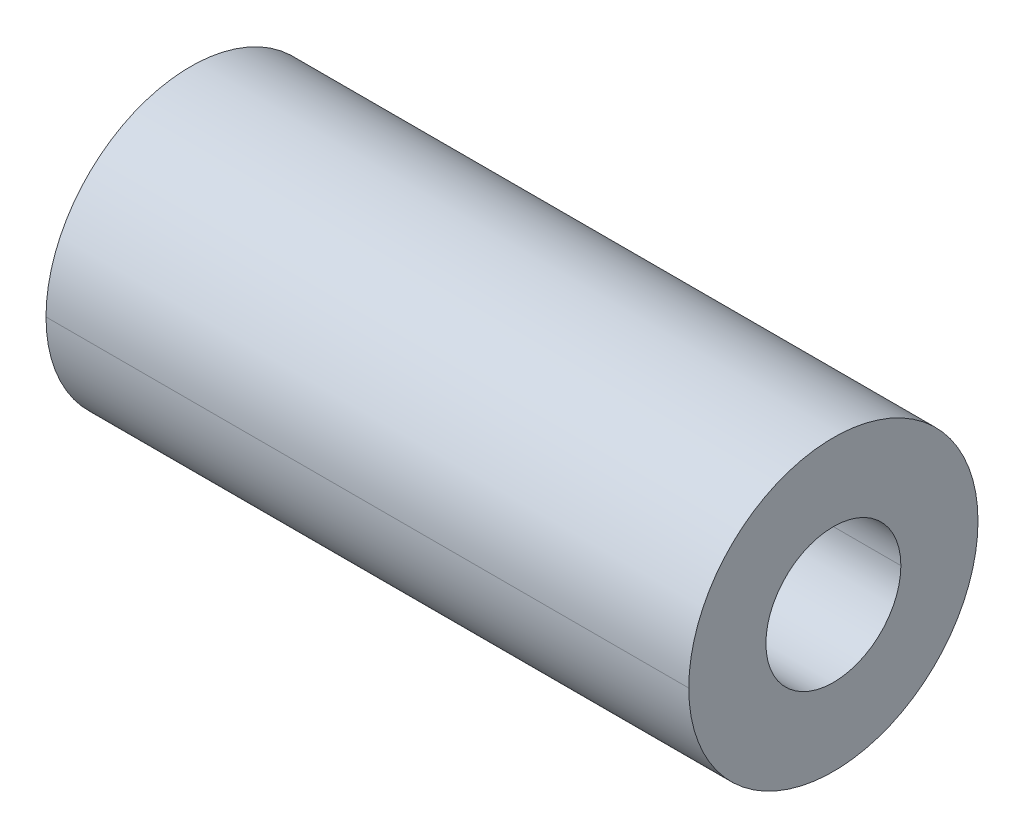
ISO-10303-21;
HEADER;
FILE_DESCRIPTION(('STEP AP214'),'2;1');
FILE_NAME('part.step','',(''),(''),'','','');
FILE_SCHEMA(('AUTOMOTIVE_DESIGN { 1 0 10303 214 1 1 1 1 }'));
ENDSEC;
DATA;
#1=APPLICATION_CONTEXT('core data for automotive mechanical design processes');
#2=APPLICATION_PROTOCOL_DEFINITION('international standard','automotive_design',2000,#1);
#3=PRODUCT_CONTEXT('',#1,'mechanical');
#4=PRODUCT('Part','Part','',(#3));
#5=PRODUCT_RELATED_PRODUCT_CATEGORY('part','',(#4));
#6=PRODUCT_DEFINITION_FORMATION('','',#4);
#7=PRODUCT_DEFINITION_CONTEXT('part definition',#1,'design');
#8=PRODUCT_DEFINITION('design','',#6,#7);
#9=PRODUCT_DEFINITION_SHAPE('','',#8);
#10=(LENGTH_UNIT() NAMED_UNIT(*) SI_UNIT(.MILLI.,.METRE.));
#11=(NAMED_UNIT(*) PLANE_ANGLE_UNIT() SI_UNIT($,.RADIAN.));
#12=(NAMED_UNIT(*) SI_UNIT($,.STERADIAN.) SOLID_ANGLE_UNIT());
#13=UNCERTAINTY_MEASURE_WITH_UNIT(LENGTH_MEASURE(1.E-05),#10,'distance_accuracy_value','');
#14=(GEOMETRIC_REPRESENTATION_CONTEXT(3) GLOBAL_UNCERTAINTY_ASSIGNED_CONTEXT((#13)) GLOBAL_UNIT_ASSIGNED_CONTEXT((#10,
#11,#12)) REPRESENTATION_CONTEXT('',''));
#15=CARTESIAN_POINT('',(0.,0.,0.));
#16=DIRECTION('',(0.,0.,1.));
#17=DIRECTION('',(1.,0.,0.));
#18=AXIS2_PLACEMENT_3D('',#15,#16,#17);
#19=CARTESIAN_POINT('',(0.,0.,0.));
#20=DIRECTION('',(1.,0.,0.));
#21=DIRECTION('',(0.,0.,-1.));
#22=AXIS2_PLACEMENT_3D('',#19,#20,#21);
#23=CYLINDRICAL_SURFACE('',#22,4.5);
#24=CARTESIAN_POINT('',(-20.,0.,0.));
#25=DIRECTION('',(1.,0.,0.));
#26=DIRECTION('',(0.,0.,-1.));
#27=AXIS2_PLACEMENT_3D('',#24,#25,#26);
#28=CIRCLE('',#27,4.5);
#29=CARTESIAN_POINT('',(-20.,0.,-4.5));
#30=VERTEX_POINT('',#29);
#31=CARTESIAN_POINT('',(-20.,0.,4.5));
#32=VERTEX_POINT('',#31);
#33=EDGE_CURVE('E11',#30,#32,#28,.T.);
#34=ORIENTED_EDGE('',*,*,#33,.T.);
#35=DIRECTION('',(1.,0.,0.));
#36=VECTOR('',#35,1.);
#37=CARTESIAN_POINT('',(0.,0.,4.5));
#38=LINE('',#37,#36);
#39=CARTESIAN_POINT('',(0.,0.,4.5));
#40=VERTEX_POINT('',#39);
#41=EDGE_CURVE('E27',#32,#40,#38,.T.);
#42=ORIENTED_EDGE('',*,*,#41,.T.);
#43=CARTESIAN_POINT('',(0.,0.,0.));
#44=DIRECTION('',(1.,0.,0.));
#45=DIRECTION('',(0.,0.,-1.));
#46=AXIS2_PLACEMENT_3D('',#43,#44,#45);
#47=CIRCLE('',#46,4.5);
#48=CARTESIAN_POINT('',(0.,0.,-4.5));
#49=VERTEX_POINT('',#48);
#50=EDGE_CURVE('E93',#49,#40,#47,.T.);
#51=ORIENTED_EDGE('',*,*,#50,.F.);
#52=DIRECTION('',(1.,0.,0.));
#53=VECTOR('',#52,1.);
#54=CARTESIAN_POINT('',(0.,0.,-4.5));
#55=LINE('',#54,#53);
#56=EDGE_CURVE('E81',#30,#49,#55,.T.);
#57=ORIENTED_EDGE('',*,*,#56,.F.);
#58=EDGE_LOOP('',(#34,#42,#51,#57));
#59=FACE_BOUND('',#58,.T.);
#60=ADVANCED_FACE('F17',(#59),#23,.T.);
#61=CARTESIAN_POINT('',(0.,0.,0.));
#62=DIRECTION('',(1.,0.,0.));
#63=DIRECTION('',(0.,0.,-1.));
#64=AXIS2_PLACEMENT_3D('',#61,#62,#63);
#65=CYLINDRICAL_SURFACE('',#64,2.1);
#66=CARTESIAN_POINT('',(-20.,0.,0.));
#67=DIRECTION('',(1.,0.,0.));
#68=DIRECTION('',(0.,0.,-1.));
#69=AXIS2_PLACEMENT_3D('',#66,#67,#68);
#70=CIRCLE('',#69,2.1);
#71=CARTESIAN_POINT('',(-20.,0.,2.1));
#72=VERTEX_POINT('',#71);
#73=CARTESIAN_POINT('',(-20.,0.,-2.1));
#74=VERTEX_POINT('',#73);
#75=EDGE_CURVE('E74',#72,#74,#70,.T.);
#76=ORIENTED_EDGE('',*,*,#75,.F.);
#77=DIRECTION('',(1.,0.,0.));
#78=VECTOR('',#77,1.);
#79=CARTESIAN_POINT('',(0.,0.,2.1));
#80=LINE('',#79,#78);
#81=CARTESIAN_POINT('',(0.,0.,2.1));
#82=VERTEX_POINT('',#81);
#83=EDGE_CURVE('E107',#72,#82,#80,.T.);
#84=ORIENTED_EDGE('',*,*,#83,.T.);
#85=CARTESIAN_POINT('',(0.,0.,0.));
#86=DIRECTION('',(1.,0.,0.));
#87=DIRECTION('',(0.,0.,-1.));
#88=AXIS2_PLACEMENT_3D('',#85,#86,#87);
#89=CIRCLE('',#88,2.1);
#90=CARTESIAN_POINT('',(0.,0.,-2.1));
#91=VERTEX_POINT('',#90);
#92=EDGE_CURVE('E111',#82,#91,#89,.T.);
#93=ORIENTED_EDGE('',*,*,#92,.T.);
#94=DIRECTION('',(1.,0.,0.));
#95=VECTOR('',#94,1.);
#96=CARTESIAN_POINT('',(0.,0.,-2.1));
#97=LINE('',#96,#95);
#98=EDGE_CURVE('E63',#74,#91,#97,.T.);
#99=ORIENTED_EDGE('',*,*,#98,.F.);
#100=EDGE_LOOP('',(#76,#84,#93,#99));
#101=FACE_BOUND('',#100,.T.);
#102=ADVANCED_FACE('F163',(#101),#65,.F.);
#103=CARTESIAN_POINT('',(0.,0.,0.));
#104=DIRECTION('',(1.,0.,0.));
#105=DIRECTION('',(0.,0.,-1.));
#106=AXIS2_PLACEMENT_3D('',#103,#104,#105);
#107=CYLINDRICAL_SURFACE('',#106,2.1);
#108=ORIENTED_EDGE('',*,*,#83,.F.);
#109=CARTESIAN_POINT('',(-20.,0.,0.));
#110=DIRECTION('',(1.,0.,0.));
#111=DIRECTION('',(0.,0.,-1.));
#112=AXIS2_PLACEMENT_3D('',#109,#110,#111);
#113=CIRCLE('',#112,2.1);
#114=EDGE_CURVE('E91',#74,#72,#113,.T.);
#115=ORIENTED_EDGE('',*,*,#114,.F.);
#116=ORIENTED_EDGE('',*,*,#98,.T.);
#117=CARTESIAN_POINT('',(0.,0.,0.));
#118=DIRECTION('',(1.,0.,0.));
#119=DIRECTION('',(0.,0.,-1.));
#120=AXIS2_PLACEMENT_3D('',#117,#118,#119);
#121=CIRCLE('',#120,2.1);
#122=EDGE_CURVE('E96',#91,#82,#121,.T.);
#123=ORIENTED_EDGE('',*,*,#122,.T.);
#124=EDGE_LOOP('',(#108,#115,#116,#123));
#125=FACE_BOUND('',#124,.T.);
#126=ADVANCED_FACE('F139',(#125),#107,.F.);
#127=CARTESIAN_POINT('',(0.,2.1,0.));
#128=DIRECTION('',(1.,0.,0.));
#129=DIRECTION('',(0.,1.,0.));
#130=AXIS2_PLACEMENT_3D('',#127,#128,#129);
#131=PLANE('',#130);
#132=ORIENTED_EDGE('',*,*,#50,.T.);
#133=CARTESIAN_POINT('',(0.,0.,0.));
#134=DIRECTION('',(1.,0.,0.));
#135=DIRECTION('',(0.,0.,-1.));
#136=AXIS2_PLACEMENT_3D('',#133,#134,#135);
#137=CIRCLE('',#136,4.5);
#138=EDGE_CURVE('E87',#40,#49,#137,.T.);
#139=ORIENTED_EDGE('',*,*,#138,.T.);
#140=EDGE_LOOP('',(#132,#139));
#141=FACE_BOUND('',#140,.T.);
#142=ORIENTED_EDGE('',*,*,#122,.F.);
#143=ORIENTED_EDGE('',*,*,#92,.F.);
#144=EDGE_LOOP('',(#142,#143));
#145=FACE_BOUND('',#144,.T.);
#146=ADVANCED_FACE('F98',(#141,#145),#131,.T.);
#147=CARTESIAN_POINT('',(0.,0.,0.));
#148=DIRECTION('',(1.,0.,0.));
#149=DIRECTION('',(0.,0.,-1.));
#150=AXIS2_PLACEMENT_3D('',#147,#148,#149);
#151=CYLINDRICAL_SURFACE('',#150,4.5);
#152=ORIENTED_EDGE('',*,*,#41,.F.);
#153=CARTESIAN_POINT('',(-20.,0.,0.));
#154=DIRECTION('',(1.,0.,0.));
#155=DIRECTION('',(0.,0.,-1.));
#156=AXIS2_PLACEMENT_3D('',#153,#154,#155);
#157=CIRCLE('',#156,4.5);
#158=EDGE_CURVE('E89',#32,#30,#157,.T.);
#159=ORIENTED_EDGE('',*,*,#158,.T.);
#160=ORIENTED_EDGE('',*,*,#56,.T.);
#161=ORIENTED_EDGE('',*,*,#138,.F.);
#162=EDGE_LOOP('',(#152,#159,#160,#161));
#163=FACE_BOUND('',#162,.T.);
#164=ADVANCED_FACE('F19',(#163),#151,.T.);
#165=CARTESIAN_POINT('',(-20.,4.5,0.));
#166=DIRECTION('',(-1.,0.,0.));
#167=DIRECTION('',(0.,0.,1.));
#168=AXIS2_PLACEMENT_3D('',#165,#166,#167);
#169=PLANE('',#168);
#170=ORIENTED_EDGE('',*,*,#33,.F.);
#171=ORIENTED_EDGE('',*,*,#158,.F.);
#172=EDGE_LOOP('',(#170,#171));
#173=FACE_BOUND('',#172,.T.);
#174=ORIENTED_EDGE('',*,*,#114,.T.);
#175=ORIENTED_EDGE('',*,*,#75,.T.);
#176=EDGE_LOOP('',(#174,#175));
#177=FACE_BOUND('',#176,.T.);
#178=ADVANCED_FACE('F148',(#173,#177),#169,.T.);
#179=CLOSED_SHELL('',(#60,#102,#126,#146,#164,#178));
#180=MANIFOLD_SOLID_BREP('B1',#179);
#181=ADVANCED_BREP_SHAPE_REPRESENTATION('',(#18,#180),#14);
#182=SHAPE_DEFINITION_REPRESENTATION(#9,#181);
ENDSEC;
END-ISO-10303-21;
